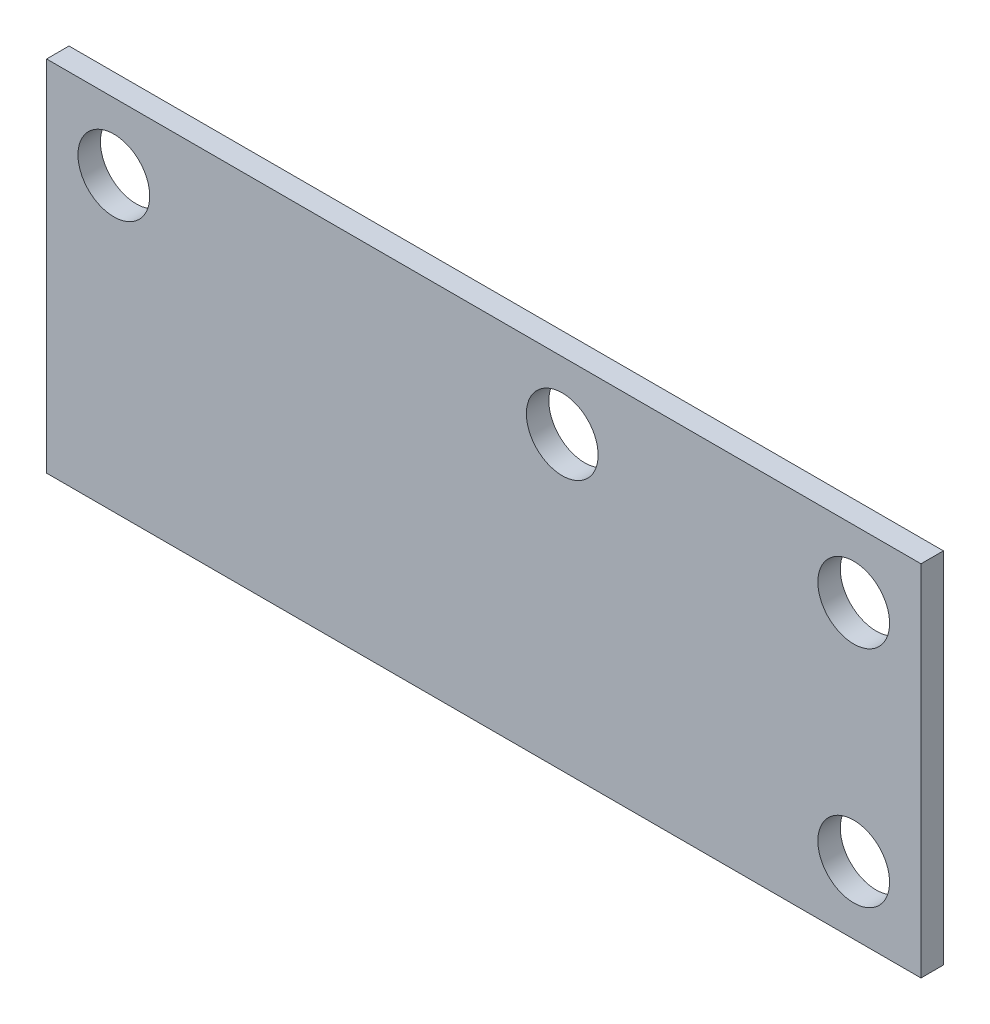
ISO-10303-21;
HEADER;
FILE_DESCRIPTION(('STEP AP214'),'2;1');
FILE_NAME('part.step','',(''),(''),'','','');
FILE_SCHEMA(('AUTOMOTIVE_DESIGN { 1 0 10303 214 1 1 1 1 }'));
ENDSEC;
DATA;
#1=APPLICATION_CONTEXT('core data for automotive mechanical design processes');
#2=APPLICATION_PROTOCOL_DEFINITION('international standard','automotive_design',2000,#1);
#3=PRODUCT_CONTEXT('',#1,'mechanical');
#4=PRODUCT('Part','Part','',(#3));
#5=PRODUCT_RELATED_PRODUCT_CATEGORY('part','',(#4));
#6=PRODUCT_DEFINITION_FORMATION('','',#4);
#7=PRODUCT_DEFINITION_CONTEXT('part definition',#1,'design');
#8=PRODUCT_DEFINITION('design','',#6,#7);
#9=PRODUCT_DEFINITION_SHAPE('','',#8);
#10=(LENGTH_UNIT() NAMED_UNIT(*) SI_UNIT(.MILLI.,.METRE.));
#11=(NAMED_UNIT(*) PLANE_ANGLE_UNIT() SI_UNIT($,.RADIAN.));
#12=(NAMED_UNIT(*) SI_UNIT($,.STERADIAN.) SOLID_ANGLE_UNIT());
#13=UNCERTAINTY_MEASURE_WITH_UNIT(LENGTH_MEASURE(1.E-05),#10,'distance_accuracy_value','');
#14=(GEOMETRIC_REPRESENTATION_CONTEXT(3) GLOBAL_UNCERTAINTY_ASSIGNED_CONTEXT((#13)) GLOBAL_UNIT_ASSIGNED_CONTEXT((#10,
#11,#12)) REPRESENTATION_CONTEXT('',''));
#15=CARTESIAN_POINT('',(0.,0.,0.));
#16=DIRECTION('',(0.,0.,1.));
#17=DIRECTION('',(1.,0.,0.));
#18=AXIS2_PLACEMENT_3D('',#15,#16,#17);
#19=CARTESIAN_POINT('',(0.,0.,1.));
#20=DIRECTION('',(1.,0.,0.));
#21=DIRECTION('',(0.,0.,-1.));
#22=AXIS2_PLACEMENT_3D('',#19,#20,#21);
#23=PLANE('',#22);
#24=DIRECTION('',(0.,-1.,0.));
#25=VECTOR('',#24,1.);
#26=CARTESIAN_POINT('',(0.,0.,0.));
#27=LINE('',#26,#25);
#28=CARTESIAN_POINT('',(0.,16.,0.));
#29=VERTEX_POINT('',#28);
#30=CARTESIAN_POINT('',(0.,0.,0.));
#31=VERTEX_POINT('',#30);
#32=EDGE_CURVE('E98',#29,#31,#27,.T.);
#33=ORIENTED_EDGE('',*,*,#32,.T.);
#34=DIRECTION('',(0.,0.,-1.));
#35=VECTOR('',#34,1.);
#36=CARTESIAN_POINT('',(0.,0.,1.));
#37=LINE('',#36,#35);
#38=CARTESIAN_POINT('',(0.,0.,1.));
#39=VERTEX_POINT('',#38);
#40=EDGE_CURVE('E11',#39,#31,#37,.T.);
#41=ORIENTED_EDGE('',*,*,#40,.F.);
#42=DIRECTION('',(0.,-1.,0.));
#43=VECTOR('',#42,1.);
#44=CARTESIAN_POINT('',(0.,0.,1.));
#45=LINE('',#44,#43);
#46=CARTESIAN_POINT('',(0.,16.,1.));
#47=VERTEX_POINT('',#46);
#48=EDGE_CURVE('E86',#47,#39,#45,.T.);
#49=ORIENTED_EDGE('',*,*,#48,.F.);
#50=DIRECTION('',(0.,0.,-1.));
#51=VECTOR('',#50,1.);
#52=CARTESIAN_POINT('',(0.,16.,1.));
#53=LINE('',#52,#51);
#54=EDGE_CURVE('E94',#47,#29,#53,.T.);
#55=ORIENTED_EDGE('',*,*,#54,.T.);
#56=EDGE_LOOP('',(#33,#41,#49,#55));
#57=FACE_BOUND('',#56,.T.);
#58=ADVANCED_FACE('F35',(#57),#23,.F.);
#59=CARTESIAN_POINT('',(0.,0.,1.));
#60=DIRECTION('',(0.,1.,0.));
#61=DIRECTION('',(0.,0.,1.));
#62=AXIS2_PLACEMENT_3D('',#59,#60,#61);
#63=PLANE('',#62);
#64=DIRECTION('',(1.,0.,0.));
#65=VECTOR('',#64,1.);
#66=CARTESIAN_POINT('',(0.,0.,0.));
#67=LINE('',#66,#65);
#68=CARTESIAN_POINT('',(39.,0.,0.));
#69=VERTEX_POINT('',#68);
#70=EDGE_CURVE('E90',#31,#69,#67,.T.);
#71=ORIENTED_EDGE('',*,*,#70,.T.);
#72=DIRECTION('',(0.,0.,-1.));
#73=VECTOR('',#72,1.);
#74=CARTESIAN_POINT('',(39.,0.,1.));
#75=LINE('',#74,#73);
#76=CARTESIAN_POINT('',(39.,0.,1.));
#77=VERTEX_POINT('',#76);
#78=EDGE_CURVE('E43',#77,#69,#75,.T.);
#79=ORIENTED_EDGE('',*,*,#78,.F.);
#80=DIRECTION('',(1.,0.,0.));
#81=VECTOR('',#80,1.);
#82=CARTESIAN_POINT('',(0.,0.,1.));
#83=LINE('',#82,#81);
#84=EDGE_CURVE('E81',#39,#77,#83,.T.);
#85=ORIENTED_EDGE('',*,*,#84,.F.);
#86=ORIENTED_EDGE('',*,*,#40,.T.);
#87=EDGE_LOOP('',(#71,#79,#85,#86));
#88=FACE_BOUND('',#87,.T.);
#89=ADVANCED_FACE('F89',(#88),#63,.F.);
#90=CARTESIAN_POINT('',(39.,0.,1.));
#91=DIRECTION('',(-1.,0.,0.));
#92=DIRECTION('',(0.,0.,1.));
#93=AXIS2_PLACEMENT_3D('',#90,#91,#92);
#94=PLANE('',#93);
#95=DIRECTION('',(0.,1.,0.));
#96=VECTOR('',#95,1.);
#97=CARTESIAN_POINT('',(39.,0.,0.));
#98=LINE('',#97,#96);
#99=CARTESIAN_POINT('',(39.,16.,0.));
#100=VERTEX_POINT('',#99);
#101=EDGE_CURVE('E68',#69,#100,#98,.T.);
#102=ORIENTED_EDGE('',*,*,#101,.T.);
#103=DIRECTION('',(0.,0.,-1.));
#104=VECTOR('',#103,1.);
#105=CARTESIAN_POINT('',(39.,16.,1.));
#106=LINE('',#105,#104);
#107=CARTESIAN_POINT('',(39.,16.,1.));
#108=VERTEX_POINT('',#107);
#109=EDGE_CURVE('E91',#108,#100,#106,.T.);
#110=ORIENTED_EDGE('',*,*,#109,.F.);
#111=DIRECTION('',(0.,1.,0.));
#112=VECTOR('',#111,1.);
#113=CARTESIAN_POINT('',(39.,0.,1.));
#114=LINE('',#113,#112);
#115=EDGE_CURVE('E84',#77,#108,#114,.T.);
#116=ORIENTED_EDGE('',*,*,#115,.F.);
#117=ORIENTED_EDGE('',*,*,#78,.T.);
#118=EDGE_LOOP('',(#102,#110,#116,#117));
#119=FACE_BOUND('',#118,.T.);
#120=ADVANCED_FACE('F92',(#119),#94,.F.);
#121=CARTESIAN_POINT('',(0.,16.,1.));
#122=DIRECTION('',(0.,-1.,0.));
#123=DIRECTION('',(0.,0.,-1.));
#124=AXIS2_PLACEMENT_3D('',#121,#122,#123);
#125=PLANE('',#124);
#126=DIRECTION('',(-1.,0.,0.));
#127=VECTOR('',#126,1.);
#128=CARTESIAN_POINT('',(0.,16.,0.));
#129=LINE('',#128,#127);
#130=EDGE_CURVE('E74',#100,#29,#129,.T.);
#131=ORIENTED_EDGE('',*,*,#130,.T.);
#132=ORIENTED_EDGE('',*,*,#54,.F.);
#133=DIRECTION('',(-1.,0.,0.));
#134=VECTOR('',#133,1.);
#135=CARTESIAN_POINT('',(0.,16.,1.));
#136=LINE('',#135,#134);
#137=EDGE_CURVE('E51',#108,#47,#136,.T.);
#138=ORIENTED_EDGE('',*,*,#137,.F.);
#139=ORIENTED_EDGE('',*,*,#109,.T.);
#140=EDGE_LOOP('',(#131,#132,#138,#139));
#141=FACE_BOUND('',#140,.T.);
#142=ADVANCED_FACE('F106',(#141),#125,.F.);
#143=CARTESIAN_POINT('',(0.,0.,1.));
#144=DIRECTION('',(0.,0.,-1.));
#145=DIRECTION('',(-1.,0.,0.));
#146=AXIS2_PLACEMENT_3D('',#143,#144,#145);
#147=PLANE('',#146);
#148=CARTESIAN_POINT('',(3.,13.,1.));
#149=DIRECTION('',(0.,0.,-1.));
#150=DIRECTION('',(-1.,0.,0.));
#151=AXIS2_PLACEMENT_3D('',#148,#149,#150);
#152=CIRCLE('',#151,1.6);
#153=CARTESIAN_POINT('',(1.4,13.,1.));
#154=VERTEX_POINT('',#153);
#155=EDGE_CURVE('E121',#154,#154,#152,.T.);
#156=ORIENTED_EDGE('',*,*,#155,.T.);
#157=EDGE_LOOP('',(#156));
#158=FACE_BOUND('',#157,.T.);
#159=CARTESIAN_POINT('',(23.,13.,1.));
#160=DIRECTION('',(0.,0.,-1.));
#161=DIRECTION('',(-1.,0.,0.));
#162=AXIS2_PLACEMENT_3D('',#159,#160,#161);
#163=CIRCLE('',#162,1.6);
#164=CARTESIAN_POINT('',(21.4,13.,1.));
#165=VERTEX_POINT('',#164);
#166=EDGE_CURVE('E127',#165,#165,#163,.T.);
#167=ORIENTED_EDGE('',*,*,#166,.T.);
#168=EDGE_LOOP('',(#167));
#169=FACE_BOUND('',#168,.T.);
#170=CARTESIAN_POINT('',(36.,3.,1.));
#171=DIRECTION('',(0.,0.,-1.));
#172=DIRECTION('',(-1.,0.,0.));
#173=AXIS2_PLACEMENT_3D('',#170,#171,#172);
#174=CIRCLE('',#173,1.6);
#175=CARTESIAN_POINT('',(34.4,3.,1.));
#176=VERTEX_POINT('',#175);
#177=EDGE_CURVE('E115',#176,#176,#174,.T.);
#178=ORIENTED_EDGE('',*,*,#177,.T.);
#179=EDGE_LOOP('',(#178));
#180=FACE_BOUND('',#179,.T.);
#181=CARTESIAN_POINT('',(36.,13.,1.));
#182=DIRECTION('',(0.,0.,-1.));
#183=DIRECTION('',(-1.,0.,0.));
#184=AXIS2_PLACEMENT_3D('',#181,#182,#183);
#185=CIRCLE('',#184,1.6);
#186=CARTESIAN_POINT('',(34.4,13.,1.));
#187=VERTEX_POINT('',#186);
#188=EDGE_CURVE('E101',#187,#187,#185,.T.);
#189=ORIENTED_EDGE('',*,*,#188,.T.);
#190=EDGE_LOOP('',(#189));
#191=FACE_BOUND('',#190,.T.);
#192=ORIENTED_EDGE('',*,*,#48,.T.);
#193=ORIENTED_EDGE('',*,*,#84,.T.);
#194=ORIENTED_EDGE('',*,*,#115,.T.);
#195=ORIENTED_EDGE('',*,*,#137,.T.);
#196=EDGE_LOOP('',(#192,#193,#194,#195));
#197=FACE_BOUND('',#196,.T.);
#198=ADVANCED_FACE('F82',(#158,#169,#180,#191,#197),#147,.F.);
#199=CARTESIAN_POINT('',(0.,0.,0.));
#200=DIRECTION('',(0.,0.,-1.));
#201=DIRECTION('',(-1.,0.,0.));
#202=AXIS2_PLACEMENT_3D('',#199,#200,#201);
#203=PLANE('',#202);
#204=CARTESIAN_POINT('',(3.,13.,0.));
#205=DIRECTION('',(0.,0.,-1.));
#206=DIRECTION('',(-1.,0.,0.));
#207=AXIS2_PLACEMENT_3D('',#204,#205,#206);
#208=CIRCLE('',#207,1.6);
#209=CARTESIAN_POINT('',(1.4,13.,0.));
#210=VERTEX_POINT('',#209);
#211=EDGE_CURVE('E118',#210,#210,#208,.T.);
#212=ORIENTED_EDGE('',*,*,#211,.F.);
#213=EDGE_LOOP('',(#212));
#214=FACE_BOUND('',#213,.T.);
#215=CARTESIAN_POINT('',(23.,13.,0.));
#216=DIRECTION('',(0.,0.,-1.));
#217=DIRECTION('',(-1.,0.,0.));
#218=AXIS2_PLACEMENT_3D('',#215,#216,#217);
#219=CIRCLE('',#218,1.6);
#220=CARTESIAN_POINT('',(21.4,13.,0.));
#221=VERTEX_POINT('',#220);
#222=EDGE_CURVE('E124',#221,#221,#219,.T.);
#223=ORIENTED_EDGE('',*,*,#222,.F.);
#224=EDGE_LOOP('',(#223));
#225=FACE_BOUND('',#224,.T.);
#226=CARTESIAN_POINT('',(36.,3.,0.));
#227=DIRECTION('',(0.,0.,-1.));
#228=DIRECTION('',(-1.,0.,0.));
#229=AXIS2_PLACEMENT_3D('',#226,#227,#228);
#230=CIRCLE('',#229,1.6);
#231=CARTESIAN_POINT('',(34.4,3.,0.));
#232=VERTEX_POINT('',#231);
#233=EDGE_CURVE('E130',#232,#232,#230,.T.);
#234=ORIENTED_EDGE('',*,*,#233,.F.);
#235=EDGE_LOOP('',(#234));
#236=FACE_BOUND('',#235,.T.);
#237=CARTESIAN_POINT('',(36.,13.,0.));
#238=DIRECTION('',(0.,0.,-1.));
#239=DIRECTION('',(-1.,0.,0.));
#240=AXIS2_PLACEMENT_3D('',#237,#238,#239);
#241=CIRCLE('',#240,1.6);
#242=CARTESIAN_POINT('',(34.4,13.,0.));
#243=VERTEX_POINT('',#242);
#244=EDGE_CURVE('E112',#243,#243,#241,.T.);
#245=ORIENTED_EDGE('',*,*,#244,.F.);
#246=EDGE_LOOP('',(#245));
#247=FACE_BOUND('',#246,.T.);
#248=ORIENTED_EDGE('',*,*,#32,.F.);
#249=ORIENTED_EDGE('',*,*,#130,.F.);
#250=ORIENTED_EDGE('',*,*,#101,.F.);
#251=ORIENTED_EDGE('',*,*,#70,.F.);
#252=EDGE_LOOP('',(#248,#249,#250,#251));
#253=FACE_BOUND('',#252,.T.);
#254=ADVANCED_FACE('F109',(#214,#225,#236,#247,#253),#203,.T.);
#255=CARTESIAN_POINT('',(36.,13.,1.));
#256=DIRECTION('',(0.,0.,-1.));
#257=DIRECTION('',(-1.,0.,0.));
#258=AXIS2_PLACEMENT_3D('',#255,#256,#257);
#259=CYLINDRICAL_SURFACE('',#258,1.6);
#260=ORIENTED_EDGE('',*,*,#188,.F.);
#261=EDGE_LOOP('',(#260));
#262=FACE_BOUND('',#261,.T.);
#263=ORIENTED_EDGE('',*,*,#244,.T.);
#264=EDGE_LOOP('',(#263));
#265=FACE_BOUND('',#264,.T.);
#266=ADVANCED_FACE('F142',(#262,#265),#259,.F.);
#267=CARTESIAN_POINT('',(36.,3.,1.));
#268=DIRECTION('',(0.,0.,-1.));
#269=DIRECTION('',(-1.,0.,0.));
#270=AXIS2_PLACEMENT_3D('',#267,#268,#269);
#271=CYLINDRICAL_SURFACE('',#270,1.6);
#272=ORIENTED_EDGE('',*,*,#177,.F.);
#273=EDGE_LOOP('',(#272));
#274=FACE_BOUND('',#273,.T.);
#275=ORIENTED_EDGE('',*,*,#233,.T.);
#276=EDGE_LOOP('',(#275));
#277=FACE_BOUND('',#276,.T.);
#278=ADVANCED_FACE('F138',(#274,#277),#271,.F.);
#279=CARTESIAN_POINT('',(23.,13.,1.));
#280=DIRECTION('',(0.,0.,-1.));
#281=DIRECTION('',(-1.,0.,0.));
#282=AXIS2_PLACEMENT_3D('',#279,#280,#281);
#283=CYLINDRICAL_SURFACE('',#282,1.6);
#284=ORIENTED_EDGE('',*,*,#166,.F.);
#285=EDGE_LOOP('',(#284));
#286=FACE_BOUND('',#285,.T.);
#287=ORIENTED_EDGE('',*,*,#222,.T.);
#288=EDGE_LOOP('',(#287));
#289=FACE_BOUND('',#288,.T.);
#290=ADVANCED_FACE('F141',(#286,#289),#283,.F.);
#291=CARTESIAN_POINT('',(3.,13.,1.));
#292=DIRECTION('',(0.,0.,-1.));
#293=DIRECTION('',(-1.,0.,0.));
#294=AXIS2_PLACEMENT_3D('',#291,#292,#293);
#295=CYLINDRICAL_SURFACE('',#294,1.6);
#296=ORIENTED_EDGE('',*,*,#155,.F.);
#297=EDGE_LOOP('',(#296));
#298=FACE_BOUND('',#297,.T.);
#299=ORIENTED_EDGE('',*,*,#211,.T.);
#300=EDGE_LOOP('',(#299));
#301=FACE_BOUND('',#300,.T.);
#302=ADVANCED_FACE('F180',(#298,#301),#295,.F.);
#303=CLOSED_SHELL('',(#58,#89,#120,#142,#198,#254,#266,#278,#290,#302));
#304=MANIFOLD_SOLID_BREP('B2',#303);
#305=ADVANCED_BREP_SHAPE_REPRESENTATION('',(#18,#304),#14);
#306=SHAPE_DEFINITION_REPRESENTATION(#9,#305);
ENDSEC;
END-ISO-10303-21;
